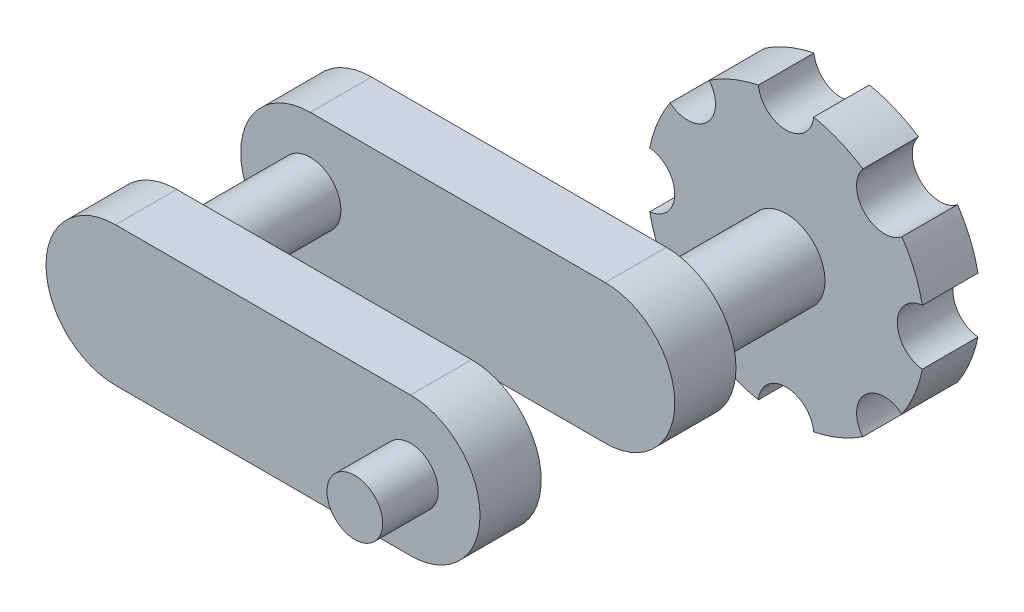
ISO-10303-21;
HEADER;
FILE_DESCRIPTION(('STEP AP214'),'2;1');
FILE_NAME('part.step','',(''),(''),'','','');
FILE_SCHEMA(('AUTOMOTIVE_DESIGN { 1 0 10303 214 1 1 1 1 }'));
ENDSEC;
DATA;
#1=APPLICATION_CONTEXT('core data for automotive mechanical design processes');
#2=APPLICATION_PROTOCOL_DEFINITION('international standard','automotive_design',2000,#1);
#3=PRODUCT_CONTEXT('',#1,'mechanical');
#4=PRODUCT('Part','Part','',(#3));
#5=PRODUCT_RELATED_PRODUCT_CATEGORY('part','',(#4));
#6=PRODUCT_DEFINITION_FORMATION('','',#4);
#7=PRODUCT_DEFINITION_CONTEXT('part definition',#1,'design');
#8=PRODUCT_DEFINITION('design','',#6,#7);
#9=PRODUCT_DEFINITION_SHAPE('','',#8);
#10=(LENGTH_UNIT() NAMED_UNIT(*) SI_UNIT(.MILLI.,.METRE.));
#11=(NAMED_UNIT(*) PLANE_ANGLE_UNIT() SI_UNIT($,.RADIAN.));
#12=(NAMED_UNIT(*) SI_UNIT($,.STERADIAN.) SOLID_ANGLE_UNIT());
#13=UNCERTAINTY_MEASURE_WITH_UNIT(LENGTH_MEASURE(1.E-05),#10,'distance_accuracy_value','');
#14=(GEOMETRIC_REPRESENTATION_CONTEXT(3) GLOBAL_UNCERTAINTY_ASSIGNED_CONTEXT((#13)) GLOBAL_UNIT_ASSIGNED_CONTEXT((#10,
#11,#12)) REPRESENTATION_CONTEXT('',''));
#15=CARTESIAN_POINT('',(0.,0.,0.));
#16=DIRECTION('',(0.,0.,1.));
#17=DIRECTION('',(1.,0.,0.));
#18=AXIS2_PLACEMENT_3D('',#15,#16,#17);
#19=CARTESIAN_POINT('',(0.,0.,-2.));
#20=DIRECTION('',(0.,0.,1.));
#21=DIRECTION('',(1.,0.,0.));
#22=AXIS2_PLACEMENT_3D('',#19,#20,#21);
#23=CYLINDRICAL_SURFACE('',#22,5.);
#24=DIRECTION('',(0.,0.,1.));
#25=VECTOR('',#24,1.);
#26=CARTESIAN_POINT('',(0.994987437106637,-4.9,-1.));
#27=LINE('',#26,#25);
#28=CARTESIAN_POINT('',(0.994987437106638,-4.9,0.));
#29=VERTEX_POINT('',#28);
#30=CARTESIAN_POINT('',(0.994987437106637,-4.9,-2.));
#31=VERTEX_POINT('',#30);
#32=EDGE_CURVE('E341',#29,#31,#27,.F.);
#33=ORIENTED_EDGE('',*,*,#32,.T.);
#34=CARTESIAN_POINT('',(0.,0.,-2.));
#35=DIRECTION('',(0.,0.,1.));
#36=DIRECTION('',(1.,0.,0.));
#37=AXIS2_PLACEMENT_3D('',#34,#35,#36);
#38=CIRCLE('',#37,5.);
#39=CARTESIAN_POINT('',(2.76126086384059,-4.16838559178758,-2.));
#40=VERTEX_POINT('',#39);
#41=EDGE_CURVE('E472',#31,#40,#38,.T.);
#42=ORIENTED_EDGE('',*,*,#41,.T.);
#43=DIRECTION('',(0.,0.,1.));
#44=VECTOR('',#43,1.);
#45=CARTESIAN_POINT('',(2.76126086384059,-4.16838559178758,-1.));
#46=LINE('',#45,#44);
#47=CARTESIAN_POINT('',(2.76126086384059,-4.16838559178758,0.));
#48=VERTEX_POINT('',#47);
#49=EDGE_CURVE('E368',#40,#48,#46,.T.);
#50=ORIENTED_EDGE('',*,*,#49,.T.);
#51=CARTESIAN_POINT('',(0.,0.,0.));
#52=DIRECTION('',(0.,0.,1.));
#53=DIRECTION('',(1.,0.,0.));
#54=AXIS2_PLACEMENT_3D('',#51,#52,#53);
#55=CIRCLE('',#54,5.);
#56=EDGE_CURVE('E457',#29,#48,#55,.T.);
#57=ORIENTED_EDGE('',*,*,#56,.F.);
#58=EDGE_LOOP('',(#33,#42,#50,#57));
#59=FACE_BOUND('',#58,.T.);
#60=ADVANCED_FACE('F36',(#59),#23,.T.);
#61=DIRECTION('',(0.,0.,1.));
#62=VECTOR('',#61,1.);
#63=CARTESIAN_POINT('',(4.16838559178761,-2.76126086384055,-1.));
#64=LINE('',#63,#62);
#65=CARTESIAN_POINT('',(4.16838559178761,-2.76126086384055,0.));
#66=VERTEX_POINT('',#65);
#67=CARTESIAN_POINT('',(4.16838559178761,-2.76126086384055,-2.));
#68=VERTEX_POINT('',#67);
#69=EDGE_CURVE('E362',#66,#68,#64,.F.);
#70=ORIENTED_EDGE('',*,*,#69,.T.);
#71=CARTESIAN_POINT('',(4.9,-0.99498743710662,-2.));
#72=VERTEX_POINT('',#71);
#73=EDGE_CURVE('E463',#68,#72,#38,.T.);
#74=ORIENTED_EDGE('',*,*,#73,.T.);
#75=DIRECTION('',(0.,0.,1.));
#76=VECTOR('',#75,1.);
#77=CARTESIAN_POINT('',(4.9,-0.99498743710662,-1.));
#78=LINE('',#77,#76);
#79=CARTESIAN_POINT('',(4.9,-0.994987437106621,0.));
#80=VERTEX_POINT('',#79);
#81=EDGE_CURVE('E357',#72,#80,#78,.T.);
#82=ORIENTED_EDGE('',*,*,#81,.T.);
#83=EDGE_CURVE('E224',#66,#80,#55,.T.);
#84=ORIENTED_EDGE('',*,*,#83,.F.);
#85=EDGE_LOOP('',(#70,#74,#82,#84));
#86=FACE_BOUND('',#85,.T.);
#87=ADVANCED_FACE('F429',(#86),#23,.T.);
#88=DIRECTION('',(0.,0.,1.));
#89=VECTOR('',#88,1.);
#90=CARTESIAN_POINT('',(4.9,0.99498743710662,-1.));
#91=LINE('',#90,#89);
#92=CARTESIAN_POINT('',(4.9,0.994987437106621,0.));
#93=VERTEX_POINT('',#92);
#94=CARTESIAN_POINT('',(4.9,0.99498743710662,-2.));
#95=VERTEX_POINT('',#94);
#96=EDGE_CURVE('E351',#93,#95,#91,.F.);
#97=ORIENTED_EDGE('',*,*,#96,.T.);
#98=CARTESIAN_POINT('',(4.16838559178757,2.7612608638406,-2.));
#99=VERTEX_POINT('',#98);
#100=EDGE_CURVE('E400',#95,#99,#38,.T.);
#101=ORIENTED_EDGE('',*,*,#100,.T.);
#102=DIRECTION('',(0.,0.,1.));
#103=VECTOR('',#102,1.);
#104=CARTESIAN_POINT('',(4.16838559178757,2.7612608638406,-1.));
#105=LINE('',#104,#103);
#106=CARTESIAN_POINT('',(4.16838559178757,2.7612608638406,0.));
#107=VERTEX_POINT('',#106);
#108=EDGE_CURVE('E347',#99,#107,#105,.T.);
#109=ORIENTED_EDGE('',*,*,#108,.T.);
#110=EDGE_CURVE('E221',#93,#107,#55,.T.);
#111=ORIENTED_EDGE('',*,*,#110,.F.);
#112=EDGE_LOOP('',(#97,#101,#109,#111));
#113=FACE_BOUND('',#112,.T.);
#114=ADVANCED_FACE('F435',(#113),#23,.T.);
#115=DIRECTION('',(0.,0.,1.));
#116=VECTOR('',#115,1.);
#117=CARTESIAN_POINT('',(2.76126086384053,4.16838559178762,-1.));
#118=LINE('',#117,#116);
#119=CARTESIAN_POINT('',(2.76126086384053,4.16838559178762,0.));
#120=VERTEX_POINT('',#119);
#121=CARTESIAN_POINT('',(2.76126086384053,4.16838559178762,-2.));
#122=VERTEX_POINT('',#121);
#123=EDGE_CURVE('E342',#120,#122,#118,.F.);
#124=ORIENTED_EDGE('',*,*,#123,.T.);
#125=CARTESIAN_POINT('',(0.994987437106568,4.90000000000001,-2.));
#126=VERTEX_POINT('',#125);
#127=EDGE_CURVE('E212',#122,#126,#38,.T.);
#128=ORIENTED_EDGE('',*,*,#127,.T.);
#129=DIRECTION('',(0.,0.,1.));
#130=VECTOR('',#129,1.);
#131=CARTESIAN_POINT('',(0.994987437106568,4.90000000000001,-1.));
#132=LINE('',#131,#130);
#133=CARTESIAN_POINT('',(0.99498743710657,4.90000000000001,0.));
#134=VERTEX_POINT('',#133);
#135=EDGE_CURVE('E198',#126,#134,#132,.T.);
#136=ORIENTED_EDGE('',*,*,#135,.T.);
#137=EDGE_CURVE('E210',#120,#134,#55,.T.);
#138=ORIENTED_EDGE('',*,*,#137,.F.);
#139=EDGE_LOOP('',(#124,#128,#136,#138));
#140=FACE_BOUND('',#139,.T.);
#141=ADVANCED_FACE('F209',(#140),#23,.T.);
#142=DIRECTION('',(0.,0.,1.));
#143=VECTOR('',#142,1.);
#144=CARTESIAN_POINT('',(-0.994987437106671,4.89999999999999,-1.));
#145=LINE('',#144,#143);
#146=CARTESIAN_POINT('',(-0.994987437106673,4.89999999999999,0.));
#147=VERTEX_POINT('',#146);
#148=CARTESIAN_POINT('',(-0.994987437106671,4.89999999999999,-2.));
#149=VERTEX_POINT('',#148);
#150=EDGE_CURVE('E60',#147,#149,#145,.F.);
#151=ORIENTED_EDGE('',*,*,#150,.T.);
#152=CARTESIAN_POINT('',(-2.76126086384062,4.16838559178756,-2.));
#153=VERTEX_POINT('',#152);
#154=EDGE_CURVE('E395',#149,#153,#38,.T.);
#155=ORIENTED_EDGE('',*,*,#154,.T.);
#156=DIRECTION('',(0.,0.,1.));
#157=VECTOR('',#156,1.);
#158=CARTESIAN_POINT('',(-2.76126086384062,4.16838559178756,-1.));
#159=LINE('',#158,#157);
#160=CARTESIAN_POINT('',(-2.76126086384062,4.16838559178756,0.));
#161=VERTEX_POINT('',#160);
#162=EDGE_CURVE('E384',#153,#161,#159,.T.);
#163=ORIENTED_EDGE('',*,*,#162,.T.);
#164=EDGE_CURVE('E222',#147,#161,#55,.T.);
#165=ORIENTED_EDGE('',*,*,#164,.F.);
#166=EDGE_LOOP('',(#151,#155,#163,#165));
#167=FACE_BOUND('',#166,.T.);
#168=ADVANCED_FACE('F394',(#167),#23,.T.);
#169=DIRECTION('',(0.,0.,1.));
#170=VECTOR('',#169,1.);
#171=CARTESIAN_POINT('',(-4.16838559178763,2.76126086384052,-1.));
#172=LINE('',#171,#170);
#173=CARTESIAN_POINT('',(-4.16838559178763,2.76126086384052,0.));
#174=VERTEX_POINT('',#173);
#175=CARTESIAN_POINT('',(-4.16838559178763,2.76126086384052,-2.));
#176=VERTEX_POINT('',#175);
#177=EDGE_CURVE('E52',#174,#176,#172,.F.);
#178=ORIENTED_EDGE('',*,*,#177,.T.);
#179=CARTESIAN_POINT('',(-4.9,0.99498743710662,-2.));
#180=VERTEX_POINT('',#179);
#181=EDGE_CURVE('E230',#176,#180,#38,.T.);
#182=ORIENTED_EDGE('',*,*,#181,.T.);
#183=DIRECTION('',(0.,0.,1.));
#184=VECTOR('',#183,1.);
#185=CARTESIAN_POINT('',(-4.9,0.99498743710662,-1.));
#186=LINE('',#185,#184);
#187=CARTESIAN_POINT('',(-4.9,0.994987437106621,0.));
#188=VERTEX_POINT('',#187);
#189=EDGE_CURVE('E317',#180,#188,#186,.T.);
#190=ORIENTED_EDGE('',*,*,#189,.T.);
#191=EDGE_CURVE('E225',#174,#188,#55,.T.);
#192=ORIENTED_EDGE('',*,*,#191,.F.);
#193=EDGE_LOOP('',(#178,#182,#190,#192));
#194=FACE_BOUND('',#193,.T.);
#195=ADVANCED_FACE('F403',(#194),#23,.T.);
#196=DIRECTION('',(0.,0.,1.));
#197=VECTOR('',#196,1.);
#198=CARTESIAN_POINT('',(-0.994987437106603,-4.9,-1.));
#199=LINE('',#198,#197);
#200=CARTESIAN_POINT('',(-0.994987437106603,-4.9,-2.));
#201=VERTEX_POINT('',#200);
#202=CARTESIAN_POINT('',(-0.994987437106604,-4.9,0.));
#203=VERTEX_POINT('',#202);
#204=EDGE_CURVE('E377',#201,#203,#199,.T.);
#205=ORIENTED_EDGE('',*,*,#204,.T.);
#206=CARTESIAN_POINT('',(-2.76126086384056,-4.1683855917876,0.));
#207=VERTEX_POINT('',#206);
#208=EDGE_CURVE('E231',#207,#203,#55,.T.);
#209=ORIENTED_EDGE('',*,*,#208,.F.);
#210=DIRECTION('',(0.,0.,1.));
#211=VECTOR('',#210,1.);
#212=CARTESIAN_POINT('',(-2.76126086384056,-4.1683855917876,-1.));
#213=LINE('',#212,#211);
#214=CARTESIAN_POINT('',(-2.76126086384056,-4.1683855917876,-2.));
#215=VERTEX_POINT('',#214);
#216=EDGE_CURVE('E328',#207,#215,#213,.F.);
#217=ORIENTED_EDGE('',*,*,#216,.T.);
#218=EDGE_CURVE('E242',#215,#201,#38,.T.);
#219=ORIENTED_EDGE('',*,*,#218,.T.);
#220=EDGE_LOOP('',(#205,#209,#217,#219));
#221=FACE_BOUND('',#220,.T.);
#222=ADVANCED_FACE('F439',(#221),#23,.T.);
#223=DIRECTION('',(0.,0.,1.));
#224=VECTOR('',#223,1.);
#225=CARTESIAN_POINT('',(-4.16838559178759,-2.76126086384058,-1.));
#226=LINE('',#225,#224);
#227=CARTESIAN_POINT('',(-4.16838559178759,-2.76126086384058,-2.));
#228=VERTEX_POINT('',#227);
#229=CARTESIAN_POINT('',(-4.16838559178759,-2.76126086384057,0.));
#230=VERTEX_POINT('',#229);
#231=EDGE_CURVE('E335',#228,#230,#226,.T.);
#232=ORIENTED_EDGE('',*,*,#231,.T.);
#233=CARTESIAN_POINT('',(-4.9,-0.994987437106621,0.));
#234=VERTEX_POINT('',#233);
#235=EDGE_CURVE('E226',#234,#230,#55,.T.);
#236=ORIENTED_EDGE('',*,*,#235,.F.);
#237=DIRECTION('',(0.,0.,1.));
#238=VECTOR('',#237,1.);
#239=CARTESIAN_POINT('',(-4.9,-0.99498743710662,-1.));
#240=LINE('',#239,#238);
#241=CARTESIAN_POINT('',(-4.9,-0.99498743710662,-2.));
#242=VERTEX_POINT('',#241);
#243=EDGE_CURVE('E322',#234,#242,#240,.F.);
#244=ORIENTED_EDGE('',*,*,#243,.T.);
#245=EDGE_CURVE('E232',#242,#228,#38,.T.);
#246=ORIENTED_EDGE('',*,*,#245,.T.);
#247=EDGE_LOOP('',(#232,#236,#244,#246));
#248=FACE_BOUND('',#247,.T.);
#249=ADVANCED_FACE('F413',(#248),#23,.T.);
#250=CARTESIAN_POINT('',(0.,0.,-2.));
#251=DIRECTION('',(0.,0.,1.));
#252=DIRECTION('',(1.,0.,0.));
#253=AXIS2_PLACEMENT_3D('',#250,#251,#252);
#254=PLANE('',#253);
#255=CARTESIAN_POINT('',(0.,0.,-2.));
#256=DIRECTION('',(0.,0.,1.));
#257=DIRECTION('',(1.,0.,0.));
#258=AXIS2_PLACEMENT_3D('',#255,#256,#257);
#259=CIRCLE('',#258,2.5);
#260=CARTESIAN_POINT('',(2.5,0.,-2.));
#261=VERTEX_POINT('',#260);
#262=EDGE_CURVE('E45',#261,#261,#259,.T.);
#263=ORIENTED_EDGE('',*,*,#262,.T.);
#264=EDGE_LOOP('',(#263));
#265=FACE_BOUND('',#264,.T.);
#266=ORIENTED_EDGE('',*,*,#41,.F.);
#267=CARTESIAN_POINT('',(0.,-5.,-2.));
#268=DIRECTION('',(0.,0.,-1.));
#269=DIRECTION('',(0.,-1.,0.));
#270=AXIS2_PLACEMENT_3D('',#267,#268,#269);
#271=CIRCLE('',#270,1.);
#272=EDGE_CURVE('E375',#201,#31,#271,.T.);
#273=ORIENTED_EDGE('',*,*,#272,.F.);
#274=ORIENTED_EDGE('',*,*,#218,.F.);
#275=CARTESIAN_POINT('',(-3.53553390593273,-3.53553390593274,-2.));
#276=DIRECTION('',(0.,0.,-1.));
#277=DIRECTION('',(-0.707106781186546,-0.707106781186549,0.));
#278=AXIS2_PLACEMENT_3D('',#275,#276,#277);
#279=CIRCLE('',#278,1.);
#280=EDGE_CURVE('E333',#228,#215,#279,.T.);
#281=ORIENTED_EDGE('',*,*,#280,.F.);
#282=ORIENTED_EDGE('',*,*,#245,.F.);
#283=CARTESIAN_POINT('',(-5.,0.,-2.));
#284=DIRECTION('',(0.,0.,-1.));
#285=DIRECTION('',(-1.,0.,0.));
#286=AXIS2_PLACEMENT_3D('',#283,#284,#285);
#287=CIRCLE('',#286,1.);
#288=EDGE_CURVE('E326',#180,#242,#287,.T.);
#289=ORIENTED_EDGE('',*,*,#288,.F.);
#290=ORIENTED_EDGE('',*,*,#181,.F.);
#291=CARTESIAN_POINT('',(-3.53553390593278,3.53553390593269,-2.));
#292=DIRECTION('',(0.,0.,-1.));
#293=DIRECTION('',(-0.707106781186556,0.707106781186539,0.));
#294=AXIS2_PLACEMENT_3D('',#291,#292,#293);
#295=CIRCLE('',#294,1.);
#296=EDGE_CURVE('E382',#153,#176,#295,.T.);
#297=ORIENTED_EDGE('',*,*,#296,.F.);
#298=ORIENTED_EDGE('',*,*,#154,.F.);
#299=CARTESIAN_POINT('',(0.,5.,-2.));
#300=DIRECTION('',(0.,0.,-1.));
#301=DIRECTION('',(0.,1.,0.));
#302=AXIS2_PLACEMENT_3D('',#299,#300,#301);
#303=CIRCLE('',#302,1.);
#304=EDGE_CURVE('E213',#126,#149,#303,.T.);
#305=ORIENTED_EDGE('',*,*,#304,.F.);
#306=ORIENTED_EDGE('',*,*,#127,.F.);
#307=CARTESIAN_POINT('',(3.53553390593271,3.53553390593277,-2.));
#308=DIRECTION('',(0.,0.,-1.));
#309=DIRECTION('',(0.707106781186541,0.707106781186554,0.));
#310=AXIS2_PLACEMENT_3D('',#307,#308,#309);
#311=CIRCLE('',#310,1.);
#312=EDGE_CURVE('E345',#99,#122,#311,.T.);
#313=ORIENTED_EDGE('',*,*,#312,.F.);
#314=ORIENTED_EDGE('',*,*,#100,.F.);
#315=CARTESIAN_POINT('',(5.,0.,-2.));
#316=DIRECTION('',(0.,0.,-1.));
#317=DIRECTION('',(1.,0.,0.));
#318=AXIS2_PLACEMENT_3D('',#315,#316,#317);
#319=CIRCLE('',#318,1.);
#320=EDGE_CURVE('E355',#72,#95,#319,.T.);
#321=ORIENTED_EDGE('',*,*,#320,.F.);
#322=ORIENTED_EDGE('',*,*,#73,.F.);
#323=CARTESIAN_POINT('',(3.53553390593276,-3.53553390593272,-2.));
#324=DIRECTION('',(0.,0.,-1.));
#325=DIRECTION('',(0.707106781186551,-0.707106781186544,0.));
#326=AXIS2_PLACEMENT_3D('',#323,#324,#325);
#327=CIRCLE('',#326,1.);
#328=EDGE_CURVE('E366',#40,#68,#327,.T.);
#329=ORIENTED_EDGE('',*,*,#328,.F.);
#330=EDGE_LOOP('',(#266,#273,#274,#281,#282,#289,#290,#297,#298,#305,#306,#313,#314,#321,#322,#329));
#331=FACE_BOUND('',#330,.T.);
#332=ADVANCED_FACE('F398',(#265,#331),#254,.F.);
#333=CARTESIAN_POINT('',(0.,0.,0.));
#334=DIRECTION('',(0.,0.,1.));
#335=DIRECTION('',(1.,0.,0.));
#336=AXIS2_PLACEMENT_3D('',#333,#334,#335);
#337=PLANE('',#336);
#338=CARTESIAN_POINT('',(0.,-5.,0.));
#339=DIRECTION('',(0.,0.,1.));
#340=DIRECTION('',(0.,1.,0.));
#341=AXIS2_PLACEMENT_3D('',#338,#339,#340);
#342=CIRCLE('',#341,1.);
#343=EDGE_CURVE('E365',#203,#29,#342,.F.);
#344=ORIENTED_EDGE('',*,*,#343,.T.);
#345=ORIENTED_EDGE('',*,*,#56,.T.);
#346=CARTESIAN_POINT('',(3.53553390593276,-3.53553390593272,0.));
#347=DIRECTION('',(0.,0.,1.));
#348=DIRECTION('',(-0.707106781186551,0.707106781186544,0.));
#349=AXIS2_PLACEMENT_3D('',#346,#347,#348);
#350=CIRCLE('',#349,1.);
#351=EDGE_CURVE('E354',#48,#66,#350,.F.);
#352=ORIENTED_EDGE('',*,*,#351,.T.);
#353=ORIENTED_EDGE('',*,*,#83,.T.);
#354=CARTESIAN_POINT('',(5.,0.,0.));
#355=DIRECTION('',(0.,0.,1.));
#356=DIRECTION('',(-1.,0.,0.));
#357=AXIS2_PLACEMENT_3D('',#354,#355,#356);
#358=CIRCLE('',#357,1.);
#359=EDGE_CURVE('E344',#80,#93,#358,.F.);
#360=ORIENTED_EDGE('',*,*,#359,.T.);
#361=ORIENTED_EDGE('',*,*,#110,.T.);
#362=CARTESIAN_POINT('',(3.53553390593271,3.53553390593277,0.));
#363=DIRECTION('',(0.,0.,1.));
#364=DIRECTION('',(-0.707106781186541,-0.707106781186554,0.));
#365=AXIS2_PLACEMENT_3D('',#362,#363,#364);
#366=CIRCLE('',#365,1.);
#367=EDGE_CURVE('E220',#107,#120,#366,.F.);
#368=ORIENTED_EDGE('',*,*,#367,.T.);
#369=ORIENTED_EDGE('',*,*,#137,.T.);
#370=CARTESIAN_POINT('',(0.,5.,0.));
#371=DIRECTION('',(0.,0.,1.));
#372=DIRECTION('',(0.,-1.,0.));
#373=AXIS2_PLACEMENT_3D('',#370,#371,#372);
#374=CIRCLE('',#373,1.);
#375=EDGE_CURVE('E195',#134,#147,#374,.F.);
#376=ORIENTED_EDGE('',*,*,#375,.T.);
#377=ORIENTED_EDGE('',*,*,#164,.T.);
#378=CARTESIAN_POINT('',(-3.53553390593278,3.53553390593269,0.));
#379=DIRECTION('',(0.,0.,1.));
#380=DIRECTION('',(0.707106781186556,-0.707106781186539,0.));
#381=AXIS2_PLACEMENT_3D('',#378,#379,#380);
#382=CIRCLE('',#381,1.);
#383=EDGE_CURVE('E387',#161,#174,#382,.F.);
#384=ORIENTED_EDGE('',*,*,#383,.T.);
#385=ORIENTED_EDGE('',*,*,#191,.T.);
#386=CARTESIAN_POINT('',(-5.,0.,0.));
#387=DIRECTION('',(0.,0.,1.));
#388=DIRECTION('',(1.,0.,0.));
#389=AXIS2_PLACEMENT_3D('',#386,#387,#388);
#390=CIRCLE('',#389,1.);
#391=EDGE_CURVE('E325',#188,#234,#390,.F.);
#392=ORIENTED_EDGE('',*,*,#391,.T.);
#393=ORIENTED_EDGE('',*,*,#235,.T.);
#394=CARTESIAN_POINT('',(-3.53553390593273,-3.53553390593274,0.));
#395=DIRECTION('',(0.,0.,1.));
#396=DIRECTION('',(0.707106781186546,0.707106781186549,0.));
#397=AXIS2_PLACEMENT_3D('',#394,#395,#396);
#398=CIRCLE('',#397,1.);
#399=EDGE_CURVE('E338',#230,#207,#398,.F.);
#400=ORIENTED_EDGE('',*,*,#399,.T.);
#401=ORIENTED_EDGE('',*,*,#208,.T.);
#402=EDGE_LOOP('',(#344,#345,#352,#353,#360,#361,#368,#369,#376,#377,#384,#385,#392,#393,#400,#401));
#403=FACE_BOUND('',#402,.T.);
#404=CARTESIAN_POINT('',(0.,0.,0.));
#405=DIRECTION('',(0.,0.,1.));
#406=DIRECTION('',(1.,0.,0.));
#407=AXIS2_PLACEMENT_3D('',#404,#405,#406);
#408=CIRCLE('',#407,1.4);
#409=CARTESIAN_POINT('',(-1.4,0.,0.));
#410=VERTEX_POINT('',#409);
#411=EDGE_CURVE('E235',#410,#410,#408,.T.);
#412=ORIENTED_EDGE('',*,*,#411,.F.);
#413=EDGE_LOOP('',(#412));
#414=FACE_BOUND('',#413,.T.);
#415=ADVANCED_FACE('F217',(#403,#414),#337,.T.);
#416=CARTESIAN_POINT('',(0.,0.,4.3));
#417=DIRECTION('',(0.,0.,-1.));
#418=DIRECTION('',(-1.,0.,0.));
#419=AXIS2_PLACEMENT_3D('',#416,#417,#418);
#420=CYLINDRICAL_SURFACE('',#419,1.4);
#421=CARTESIAN_POINT('',(0.,0.,4.3));
#422=DIRECTION('',(0.,0.,1.));
#423=DIRECTION('',(1.,0.,0.));
#424=AXIS2_PLACEMENT_3D('',#421,#422,#423);
#425=CIRCLE('',#424,1.4);
#426=CARTESIAN_POINT('',(-1.4,0.,4.3));
#427=VERTEX_POINT('',#426);
#428=EDGE_CURVE('E244',#427,#427,#425,.T.);
#429=CARTESIAN_POINT('',(-1.4,0.,4.3));
#430=CARTESIAN_POINT('',(-1.4,0.,4.25520833333333));
#431=CARTESIAN_POINT('',(-1.4,0.,4.21041666666667));
#432=CARTESIAN_POINT('',(-1.4,0.,4.12083333333333));
#433=CARTESIAN_POINT('',(-1.4,0.,4.07604166666667));
#434=CARTESIAN_POINT('',(-1.4,0.,3.98645833333333));
#435=CARTESIAN_POINT('',(-1.4,0.,3.94166666666667));
#436=CARTESIAN_POINT('',(-1.4,0.,3.85208333333333));
#437=CARTESIAN_POINT('',(-1.4,0.,3.80729166666667));
#438=CARTESIAN_POINT('',(-1.4,0.,3.71770833333333));
#439=CARTESIAN_POINT('',(-1.4,0.,3.67291666666667));
#440=CARTESIAN_POINT('',(-1.4,0.,3.58333333333333));
#441=CARTESIAN_POINT('',(-1.4,0.,3.53854166666667));
#442=CARTESIAN_POINT('',(-1.4,0.,3.44895833333333));
#443=CARTESIAN_POINT('',(-1.4,0.,3.40416666666667));
#444=CARTESIAN_POINT('',(-1.4,0.,3.31458333333333));
#445=CARTESIAN_POINT('',(-1.4,0.,3.26979166666667));
#446=CARTESIAN_POINT('',(-1.4,0.,3.18020833333333));
#447=CARTESIAN_POINT('',(-1.4,0.,3.13541666666667));
#448=CARTESIAN_POINT('',(-1.4,0.,3.04583333333333));
#449=CARTESIAN_POINT('',(-1.4,0.,3.00104166666667));
#450=CARTESIAN_POINT('',(-1.4,0.,2.91145833333333));
#451=CARTESIAN_POINT('',(-1.4,0.,2.86666666666667));
#452=CARTESIAN_POINT('',(-1.4,0.,2.77708333333333));
#453=CARTESIAN_POINT('',(-1.4,0.,2.73229166666667));
#454=CARTESIAN_POINT('',(-1.4,0.,2.64270833333333));
#455=CARTESIAN_POINT('',(-1.4,0.,2.59791666666667));
#456=CARTESIAN_POINT('',(-1.4,0.,2.50833333333333));
#457=CARTESIAN_POINT('',(-1.4,0.,2.46354166666667));
#458=CARTESIAN_POINT('',(-1.4,0.,2.37395833333333));
#459=CARTESIAN_POINT('',(-1.4,0.,2.32916666666667));
#460=CARTESIAN_POINT('',(-1.4,0.,2.23958333333333));
#461=CARTESIAN_POINT('',(-1.4,0.,2.19479166666667));
#462=CARTESIAN_POINT('',(-1.4,0.,2.10520833333333));
#463=CARTESIAN_POINT('',(-1.4,0.,2.06041666666667));
#464=CARTESIAN_POINT('',(-1.4,0.,1.97083333333333));
#465=CARTESIAN_POINT('',(-1.4,0.,1.92604166666667));
#466=CARTESIAN_POINT('',(-1.4,0.,1.83645833333333));
#467=CARTESIAN_POINT('',(-1.4,0.,1.79166666666667));
#468=CARTESIAN_POINT('',(-1.4,0.,1.70208333333333));
#469=CARTESIAN_POINT('',(-1.4,0.,1.65729166666667));
#470=CARTESIAN_POINT('',(-1.4,0.,1.56770833333333));
#471=CARTESIAN_POINT('',(-1.4,0.,1.52291666666667));
#472=CARTESIAN_POINT('',(-1.4,0.,1.43333333333333));
#473=CARTESIAN_POINT('',(-1.4,0.,1.38854166666667));
#474=CARTESIAN_POINT('',(-1.4,0.,1.29895833333333));
#475=CARTESIAN_POINT('',(-1.4,0.,1.25416666666667));
#476=CARTESIAN_POINT('',(-1.4,0.,1.16458333333333));
#477=CARTESIAN_POINT('',(-1.4,0.,1.11979166666667));
#478=CARTESIAN_POINT('',(-1.4,0.,1.03020833333333));
#479=CARTESIAN_POINT('',(-1.4,0.,0.985416666666665));
#480=CARTESIAN_POINT('',(-1.4,0.,0.895833333333332));
#481=CARTESIAN_POINT('',(-1.4,0.,0.851041666666665));
#482=CARTESIAN_POINT('',(-1.4,0.,0.761458333333332));
#483=CARTESIAN_POINT('',(-1.4,0.,0.716666666666665));
#484=CARTESIAN_POINT('',(-1.4,0.,0.627083333333332));
#485=CARTESIAN_POINT('',(-1.4,0.,0.582291666666665));
#486=CARTESIAN_POINT('',(-1.4,0.,0.492708333333332));
#487=CARTESIAN_POINT('',(-1.4,0.,0.447916666666665));
#488=CARTESIAN_POINT('',(-1.4,0.,0.358333333333332));
#489=CARTESIAN_POINT('',(-1.4,0.,0.313541666666666));
#490=CARTESIAN_POINT('',(-1.4,0.,0.223958333333332));
#491=CARTESIAN_POINT('',(-1.4,0.,0.179166666666666));
#492=CARTESIAN_POINT('',(-1.4,0.,0.0895833333333324));
#493=CARTESIAN_POINT('',(-1.4,0.,0.0447916666666658));
#494=CARTESIAN_POINT('',(-1.4,0.,0.));
#495=B_SPLINE_CURVE_WITH_KNOTS('',3,(#429,#430,#431,#432,#433,#434,#435,#436,#437,#438,#439,
#440,#441,#442,#443,#444,#445,#446,#447,#448,#449,#450,#451,#452,#453,#454,#455,#456,#457,#458,
#459,#460,#461,#462,#463,#464,#465,#466,#467,#468,#469,#470,#471,#472,#473,#474,#475,#476,#477,
#478,#479,#480,#481,#482,#483,#484,#485,#486,#487,#488,#489,#490,#491,#492,#493,#494),
.UNSPECIFIED.,.F.,.F.,(4,2,2,2,2,2,2,2,2,2,2,2,2,2,2,2,2,2,2,2,2,2,2,2,2,2,2,2,2,2,2,2,4),(0.,
0.134375000000001,0.268750000000001,0.403125000000001,0.537500000000001,0.671875000000001,
0.806250000000001,0.940625,1.075,1.209375,1.34375,1.478125,1.6125,1.746875,1.88125,2.015625,
2.15,2.284375,2.41875,2.553125,2.6875,2.821875,2.95625,3.090625,3.225,3.359375,3.49375,3.628125,
3.7625,3.896875,4.03125,4.165625,4.3),.UNSPECIFIED.);
#496=EDGE_CURVE('BSEAM550',#427,#410,#495,.T.);
#497=ORIENTED_EDGE('',*,*,#428,.F.);
#498=ORIENTED_EDGE('',*,*,#411,.T.);
#499=ORIENTED_EDGE('',*,*,#496,.T.);
#500=ORIENTED_EDGE('',*,*,#496,.F.);
#501=EDGE_LOOP('',(#497,#499,#498,#500));
#502=FACE_BOUND('',#501,.T.);
#503=ADVANCED_FACE('F550',(#502),#420,.T.);
#504=CARTESIAN_POINT('',(0.,0.,6.5));
#505=DIRECTION('',(0.,0.,-1.));
#506=DIRECTION('',(-1.,0.,0.));
#507=AXIS2_PLACEMENT_3D('',#504,#505,#506);
#508=CYLINDRICAL_SURFACE('',#507,2.5);
#509=CARTESIAN_POINT('',(0.,0.,4.3));
#510=DIRECTION('',(0.,0.,1.));
#511=DIRECTION('',(1.,0.,0.));
#512=AXIS2_PLACEMENT_3D('',#509,#510,#511);
#513=CIRCLE('',#512,2.5);
#514=CARTESIAN_POINT('',(0.,-2.5,4.3));
#515=VERTEX_POINT('',#514);
#516=CARTESIAN_POINT('',(0.,2.5,4.3));
#517=VERTEX_POINT('',#516);
#518=EDGE_CURVE('E267',#515,#517,#513,.T.);
#519=ORIENTED_EDGE('',*,*,#518,.T.);
#520=DIRECTION('',(0.,0.,-1.));
#521=VECTOR('',#520,1.);
#522=CARTESIAN_POINT('',(0.,2.5,6.5));
#523=LINE('',#522,#521);
#524=CARTESIAN_POINT('',(0.,2.5,6.5));
#525=VERTEX_POINT('',#524);
#526=EDGE_CURVE('E247',#525,#517,#523,.T.);
#527=ORIENTED_EDGE('',*,*,#526,.F.);
#528=CARTESIAN_POINT('',(0.,0.,6.5));
#529=DIRECTION('',(0.,0.,1.));
#530=DIRECTION('',(1.,0.,0.));
#531=AXIS2_PLACEMENT_3D('',#528,#529,#530);
#532=CIRCLE('',#531,2.5);
#533=CARTESIAN_POINT('',(0.,-2.5,6.5));
#534=VERTEX_POINT('',#533);
#535=EDGE_CURVE('E262',#534,#525,#532,.T.);
#536=ORIENTED_EDGE('',*,*,#535,.F.);
#537=DIRECTION('',(0.,0.,-1.));
#538=VECTOR('',#537,1.);
#539=CARTESIAN_POINT('',(0.,-2.5,6.5));
#540=LINE('',#539,#538);
#541=EDGE_CURVE('E256',#534,#515,#540,.T.);
#542=ORIENTED_EDGE('',*,*,#541,.T.);
#543=EDGE_LOOP('',(#519,#527,#536,#542));
#544=FACE_BOUND('',#543,.T.);
#545=ADVANCED_FACE('F546',(#544),#508,.T.);
#546=CARTESIAN_POINT('',(0.,2.5,6.5));
#547=DIRECTION('',(0.,-1.,0.));
#548=DIRECTION('',(1.,0.,0.));
#549=AXIS2_PLACEMENT_3D('',#546,#547,#548);
#550=PLANE('',#549);
#551=DIRECTION('',(-1.,0.,0.));
#552=VECTOR('',#551,1.);
#553=CARTESIAN_POINT('',(0.,2.5,4.3));
#554=LINE('',#553,#552);
#555=CARTESIAN_POINT('',(-10.6,2.5,4.3));
#556=VERTEX_POINT('',#555);
#557=EDGE_CURVE('E265',#517,#556,#554,.T.);
#558=ORIENTED_EDGE('',*,*,#557,.T.);
#559=DIRECTION('',(0.,0.,-1.));
#560=VECTOR('',#559,1.);
#561=CARTESIAN_POINT('',(-10.6,2.5,6.5));
#562=LINE('',#561,#560);
#563=CARTESIAN_POINT('',(-10.6,2.5,6.5));
#564=VERTEX_POINT('',#563);
#565=EDGE_CURVE('E250',#564,#556,#562,.T.);
#566=ORIENTED_EDGE('',*,*,#565,.F.);
#567=DIRECTION('',(-1.,0.,0.));
#568=VECTOR('',#567,1.);
#569=CARTESIAN_POINT('',(0.,2.5,6.5));
#570=LINE('',#569,#568);
#571=EDGE_CURVE('E274',#525,#564,#570,.T.);
#572=ORIENTED_EDGE('',*,*,#571,.F.);
#573=ORIENTED_EDGE('',*,*,#526,.T.);
#574=EDGE_LOOP('',(#558,#566,#572,#573));
#575=FACE_BOUND('',#574,.T.);
#576=ADVANCED_FACE('F542',(#575),#550,.F.);
#577=CARTESIAN_POINT('',(-10.6,0.,6.5));
#578=DIRECTION('',(0.,0.,-1.));
#579=DIRECTION('',(-1.,0.,0.));
#580=AXIS2_PLACEMENT_3D('',#577,#578,#579);
#581=CYLINDRICAL_SURFACE('',#580,2.5);
#582=CARTESIAN_POINT('',(-10.6,0.,4.3));
#583=DIRECTION('',(0.,0.,1.));
#584=DIRECTION('',(1.,0.,0.));
#585=AXIS2_PLACEMENT_3D('',#582,#583,#584);
#586=CIRCLE('',#585,2.5);
#587=CARTESIAN_POINT('',(-10.6,-2.5,4.3));
#588=VERTEX_POINT('',#587);
#589=EDGE_CURVE('E263',#556,#588,#586,.T.);
#590=ORIENTED_EDGE('',*,*,#589,.T.);
#591=DIRECTION('',(0.,0.,-1.));
#592=VECTOR('',#591,1.);
#593=CARTESIAN_POINT('',(-10.6,-2.5,6.5));
#594=LINE('',#593,#592);
#595=CARTESIAN_POINT('',(-10.6,-2.5,6.5));
#596=VERTEX_POINT('',#595);
#597=EDGE_CURVE('E253',#596,#588,#594,.T.);
#598=ORIENTED_EDGE('',*,*,#597,.F.);
#599=CARTESIAN_POINT('',(-10.6,0.,6.5));
#600=DIRECTION('',(0.,0.,1.));
#601=DIRECTION('',(1.,0.,0.));
#602=AXIS2_PLACEMENT_3D('',#599,#600,#601);
#603=CIRCLE('',#602,2.5);
#604=EDGE_CURVE('E272',#564,#596,#603,.T.);
#605=ORIENTED_EDGE('',*,*,#604,.F.);
#606=ORIENTED_EDGE('',*,*,#565,.T.);
#607=EDGE_LOOP('',(#590,#598,#605,#606));
#608=FACE_BOUND('',#607,.T.);
#609=ADVANCED_FACE('F538',(#608),#581,.T.);
#610=CARTESIAN_POINT('',(0.,-2.5,6.5));
#611=DIRECTION('',(0.,1.,0.));
#612=DIRECTION('',(-1.,0.,0.));
#613=AXIS2_PLACEMENT_3D('',#610,#611,#612);
#614=PLANE('',#613);
#615=DIRECTION('',(1.,0.,0.));
#616=VECTOR('',#615,1.);
#617=CARTESIAN_POINT('',(0.,-2.5,4.3));
#618=LINE('',#617,#616);
#619=EDGE_CURVE('E260',#588,#515,#618,.T.);
#620=ORIENTED_EDGE('',*,*,#619,.T.);
#621=ORIENTED_EDGE('',*,*,#541,.F.);
#622=DIRECTION('',(1.,0.,0.));
#623=VECTOR('',#622,1.);
#624=CARTESIAN_POINT('',(0.,-2.5,6.5));
#625=LINE('',#624,#623);
#626=EDGE_CURVE('E259',#596,#534,#625,.T.);
#627=ORIENTED_EDGE('',*,*,#626,.F.);
#628=ORIENTED_EDGE('',*,*,#597,.T.);
#629=EDGE_LOOP('',(#620,#621,#627,#628));
#630=FACE_BOUND('',#629,.T.);
#631=ADVANCED_FACE('F531',(#630),#614,.F.);
#632=CARTESIAN_POINT('',(0.,0.,6.5));
#633=DIRECTION('',(0.,0.,1.));
#634=DIRECTION('',(1.,0.,0.));
#635=AXIS2_PLACEMENT_3D('',#632,#633,#634);
#636=PLANE('',#635);
#637=CARTESIAN_POINT('',(-10.6,0.,6.5));
#638=DIRECTION('',(0.,0.,1.));
#639=DIRECTION('',(1.,0.,0.));
#640=AXIS2_PLACEMENT_3D('',#637,#638,#639);
#641=CIRCLE('',#640,1.1);
#642=CARTESIAN_POINT('',(-9.5,0.,6.5));
#643=VERTEX_POINT('',#642);
#644=EDGE_CURVE('E278',#643,#643,#641,.T.);
#645=ORIENTED_EDGE('',*,*,#644,.F.);
#646=EDGE_LOOP('',(#645));
#647=FACE_BOUND('',#646,.T.);
#648=ORIENTED_EDGE('',*,*,#535,.T.);
#649=ORIENTED_EDGE('',*,*,#571,.T.);
#650=ORIENTED_EDGE('',*,*,#604,.T.);
#651=ORIENTED_EDGE('',*,*,#626,.T.);
#652=EDGE_LOOP('',(#648,#649,#650,#651));
#653=FACE_BOUND('',#652,.T.);
#654=ADVANCED_FACE('F528',(#647,#653),#636,.T.);
#655=CARTESIAN_POINT('',(0.,0.,4.3));
#656=DIRECTION('',(0.,0.,1.));
#657=DIRECTION('',(1.,0.,0.));
#658=AXIS2_PLACEMENT_3D('',#655,#656,#657);
#659=PLANE('',#658);
#660=ORIENTED_EDGE('',*,*,#428,.T.);
#661=EDGE_LOOP('',(#660));
#662=FACE_BOUND('',#661,.T.);
#663=ORIENTED_EDGE('',*,*,#518,.F.);
#664=ORIENTED_EDGE('',*,*,#619,.F.);
#665=ORIENTED_EDGE('',*,*,#589,.F.);
#666=ORIENTED_EDGE('',*,*,#557,.F.);
#667=EDGE_LOOP('',(#663,#664,#665,#666));
#668=FACE_BOUND('',#667,.T.);
#669=ADVANCED_FACE('F526',(#662,#668),#659,.F.);
#670=CARTESIAN_POINT('',(-10.6,0.,11.3));
#671=DIRECTION('',(0.,0.,-1.));
#672=DIRECTION('',(-1.,0.,0.));
#673=AXIS2_PLACEMENT_3D('',#670,#671,#672);
#674=CYLINDRICAL_SURFACE('',#673,1.1);
#675=CARTESIAN_POINT('',(-10.6,0.,11.3));
#676=DIRECTION('',(0.,0.,1.));
#677=DIRECTION('',(1.,0.,0.));
#678=AXIS2_PLACEMENT_3D('',#675,#676,#677);
#679=CIRCLE('',#678,1.1);
#680=CARTESIAN_POINT('',(-9.5,0.,11.3));
#681=VERTEX_POINT('',#680);
#682=EDGE_CURVE('E270',#681,#681,#679,.T.);
#683=ORIENTED_EDGE('',*,*,#682,.F.);
#684=EDGE_LOOP('',(#683));
#685=FACE_BOUND('',#684,.T.);
#686=ORIENTED_EDGE('',*,*,#644,.T.);
#687=EDGE_LOOP('',(#686));
#688=FACE_BOUND('',#687,.T.);
#689=ADVANCED_FACE('F522',(#685,#688),#674,.T.);
#690=CARTESIAN_POINT('',(-10.6,0.,13.5));
#691=DIRECTION('',(0.,0.,-1.));
#692=DIRECTION('',(-1.,0.,0.));
#693=AXIS2_PLACEMENT_3D('',#690,#691,#692);
#694=CYLINDRICAL_SURFACE('',#693,2.5);
#695=CARTESIAN_POINT('',(-10.6,0.,11.3));
#696=DIRECTION('',(0.,0.,1.));
#697=DIRECTION('',(1.,0.,0.));
#698=AXIS2_PLACEMENT_3D('',#695,#696,#697);
#699=CIRCLE('',#698,2.5);
#700=CARTESIAN_POINT('',(-10.6,2.5,11.3));
#701=VERTEX_POINT('',#700);
#702=CARTESIAN_POINT('',(-10.6,-2.5,11.3));
#703=VERTEX_POINT('',#702);
#704=EDGE_CURVE('E303',#701,#703,#699,.T.);
#705=ORIENTED_EDGE('',*,*,#704,.T.);
#706=DIRECTION('',(0.,0.,-1.));
#707=VECTOR('',#706,1.);
#708=CARTESIAN_POINT('',(-10.6,-2.5,13.5));
#709=LINE('',#708,#707);
#710=CARTESIAN_POINT('',(-10.6,-2.5,13.5));
#711=VERTEX_POINT('',#710);
#712=EDGE_CURVE('E281',#711,#703,#709,.T.);
#713=ORIENTED_EDGE('',*,*,#712,.F.);
#714=CARTESIAN_POINT('',(-10.6,0.,13.5));
#715=DIRECTION('',(0.,0.,1.));
#716=DIRECTION('',(1.,0.,0.));
#717=AXIS2_PLACEMENT_3D('',#714,#715,#716);
#718=CIRCLE('',#717,2.5);
#719=CARTESIAN_POINT('',(-10.6,2.5,13.5));
#720=VERTEX_POINT('',#719);
#721=EDGE_CURVE('E298',#720,#711,#718,.T.);
#722=ORIENTED_EDGE('',*,*,#721,.F.);
#723=DIRECTION('',(0.,0.,-1.));
#724=VECTOR('',#723,1.);
#725=CARTESIAN_POINT('',(-10.6,2.5,13.5));
#726=LINE('',#725,#724);
#727=EDGE_CURVE('E292',#720,#701,#726,.T.);
#728=ORIENTED_EDGE('',*,*,#727,.T.);
#729=EDGE_LOOP('',(#705,#713,#722,#728));
#730=FACE_BOUND('',#729,.T.);
#731=ADVANCED_FACE('F518',(#730),#694,.T.);
#732=CARTESIAN_POINT('',(-10.6,-2.5,13.5));
#733=DIRECTION('',(0.,1.,0.));
#734=DIRECTION('',(0.,0.,1.));
#735=AXIS2_PLACEMENT_3D('',#732,#733,#734);
#736=PLANE('',#735);
#737=DIRECTION('',(1.,0.,0.));
#738=VECTOR('',#737,1.);
#739=CARTESIAN_POINT('',(-10.6,-2.5,11.3));
#740=LINE('',#739,#738);
#741=CARTESIAN_POINT('',(0.,-2.5,11.3));
#742=VERTEX_POINT('',#741);
#743=EDGE_CURVE('E301',#703,#742,#740,.T.);
#744=ORIENTED_EDGE('',*,*,#743,.T.);
#745=DIRECTION('',(0.,0.,-1.));
#746=VECTOR('',#745,1.);
#747=CARTESIAN_POINT('',(0.,-2.5,13.5));
#748=LINE('',#747,#746);
#749=CARTESIAN_POINT('',(0.,-2.5,13.5));
#750=VERTEX_POINT('',#749);
#751=EDGE_CURVE('E286',#750,#742,#748,.T.);
#752=ORIENTED_EDGE('',*,*,#751,.F.);
#753=DIRECTION('',(1.,0.,0.));
#754=VECTOR('',#753,1.);
#755=CARTESIAN_POINT('',(-10.6,-2.5,13.5));
#756=LINE('',#755,#754);
#757=EDGE_CURVE('E310',#711,#750,#756,.T.);
#758=ORIENTED_EDGE('',*,*,#757,.F.);
#759=ORIENTED_EDGE('',*,*,#712,.T.);
#760=EDGE_LOOP('',(#744,#752,#758,#759));
#761=FACE_BOUND('',#760,.T.);
#762=ADVANCED_FACE('F514',(#761),#736,.F.);
#763=CARTESIAN_POINT('',(0.,0.,13.5));
#764=DIRECTION('',(0.,0.,-1.));
#765=DIRECTION('',(-1.,0.,0.));
#766=AXIS2_PLACEMENT_3D('',#763,#764,#765);
#767=CYLINDRICAL_SURFACE('',#766,2.5);
#768=CARTESIAN_POINT('',(0.,0.,11.3));
#769=DIRECTION('',(0.,0.,1.));
#770=DIRECTION('',(1.,0.,0.));
#771=AXIS2_PLACEMENT_3D('',#768,#769,#770);
#772=CIRCLE('',#771,2.5);
#773=CARTESIAN_POINT('',(0.,2.5,11.3));
#774=VERTEX_POINT('',#773);
#775=EDGE_CURVE('E299',#742,#774,#772,.T.);
#776=ORIENTED_EDGE('',*,*,#775,.T.);
#777=DIRECTION('',(0.,0.,-1.));
#778=VECTOR('',#777,1.);
#779=CARTESIAN_POINT('',(0.,2.5,13.5));
#780=LINE('',#779,#778);
#781=CARTESIAN_POINT('',(0.,2.5,13.5));
#782=VERTEX_POINT('',#781);
#783=EDGE_CURVE('E289',#782,#774,#780,.T.);
#784=ORIENTED_EDGE('',*,*,#783,.F.);
#785=CARTESIAN_POINT('',(0.,0.,13.5));
#786=DIRECTION('',(0.,0.,1.));
#787=DIRECTION('',(1.,0.,0.));
#788=AXIS2_PLACEMENT_3D('',#785,#786,#787);
#789=CIRCLE('',#788,2.5);
#790=EDGE_CURVE('E308',#750,#782,#789,.T.);
#791=ORIENTED_EDGE('',*,*,#790,.F.);
#792=ORIENTED_EDGE('',*,*,#751,.T.);
#793=EDGE_LOOP('',(#776,#784,#791,#792));
#794=FACE_BOUND('',#793,.T.);
#795=ADVANCED_FACE('F510',(#794),#767,.T.);
#796=CARTESIAN_POINT('',(-10.6,2.5,13.5));
#797=DIRECTION('',(0.,-1.,0.));
#798=DIRECTION('',(0.,0.,-1.));
#799=AXIS2_PLACEMENT_3D('',#796,#797,#798);
#800=PLANE('',#799);
#801=DIRECTION('',(-1.,0.,0.));
#802=VECTOR('',#801,1.);
#803=CARTESIAN_POINT('',(-10.6,2.5,11.3));
#804=LINE('',#803,#802);
#805=EDGE_CURVE('E296',#774,#701,#804,.T.);
#806=ORIENTED_EDGE('',*,*,#805,.T.);
#807=ORIENTED_EDGE('',*,*,#727,.F.);
#808=DIRECTION('',(-1.,0.,0.));
#809=VECTOR('',#808,1.);
#810=CARTESIAN_POINT('',(-10.6,2.5,13.5));
#811=LINE('',#810,#809);
#812=EDGE_CURVE('E295',#782,#720,#811,.T.);
#813=ORIENTED_EDGE('',*,*,#812,.F.);
#814=ORIENTED_EDGE('',*,*,#783,.T.);
#815=EDGE_LOOP('',(#806,#807,#813,#814));
#816=FACE_BOUND('',#815,.T.);
#817=ADVANCED_FACE('F503',(#816),#800,.F.);
#818=CARTESIAN_POINT('',(-10.6,0.,13.5));
#819=DIRECTION('',(0.,0.,1.));
#820=DIRECTION('',(1.,0.,0.));
#821=AXIS2_PLACEMENT_3D('',#818,#819,#820);
#822=PLANE('',#821);
#823=CARTESIAN_POINT('',(0.,0.,13.5));
#824=DIRECTION('',(0.,0.,1.));
#825=DIRECTION('',(1.,0.,0.));
#826=AXIS2_PLACEMENT_3D('',#823,#824,#825);
#827=CIRCLE('',#826,1.);
#828=CARTESIAN_POINT('',(1.,0.,13.5));
#829=VERTEX_POINT('',#828);
#830=EDGE_CURVE('E314',#829,#829,#827,.T.);
#831=ORIENTED_EDGE('',*,*,#830,.F.);
#832=EDGE_LOOP('',(#831));
#833=FACE_BOUND('',#832,.T.);
#834=ORIENTED_EDGE('',*,*,#721,.T.);
#835=ORIENTED_EDGE('',*,*,#757,.T.);
#836=ORIENTED_EDGE('',*,*,#790,.T.);
#837=ORIENTED_EDGE('',*,*,#812,.T.);
#838=EDGE_LOOP('',(#834,#835,#836,#837));
#839=FACE_BOUND('',#838,.T.);
#840=ADVANCED_FACE('F500',(#833,#839),#822,.T.);
#841=CARTESIAN_POINT('',(-10.6,0.,11.3));
#842=DIRECTION('',(0.,0.,1.));
#843=DIRECTION('',(1.,0.,0.));
#844=AXIS2_PLACEMENT_3D('',#841,#842,#843);
#845=PLANE('',#844);
#846=ORIENTED_EDGE('',*,*,#682,.T.);
#847=EDGE_LOOP('',(#846));
#848=FACE_BOUND('',#847,.T.);
#849=ORIENTED_EDGE('',*,*,#704,.F.);
#850=ORIENTED_EDGE('',*,*,#805,.F.);
#851=ORIENTED_EDGE('',*,*,#775,.F.);
#852=ORIENTED_EDGE('',*,*,#743,.F.);
#853=EDGE_LOOP('',(#849,#850,#851,#852));
#854=FACE_BOUND('',#853,.T.);
#855=ADVANCED_FACE('F498',(#848,#854),#845,.F.);
#856=CARTESIAN_POINT('',(0.,0.,15.5));
#857=DIRECTION('',(0.,0.,-1.));
#858=DIRECTION('',(-1.,0.,0.));
#859=AXIS2_PLACEMENT_3D('',#856,#857,#858);
#860=CYLINDRICAL_SURFACE('',#859,1.);
#861=CARTESIAN_POINT('',(0.,0.,15.5));
#862=DIRECTION('',(0.,0.,1.));
#863=DIRECTION('',(1.,0.,0.));
#864=AXIS2_PLACEMENT_3D('',#861,#862,#863);
#865=CIRCLE('',#864,1.);
#866=CARTESIAN_POINT('',(1.,0.,15.5));
#867=VERTEX_POINT('',#866);
#868=EDGE_CURVE('E306',#867,#867,#865,.T.);
#869=ORIENTED_EDGE('',*,*,#868,.F.);
#870=EDGE_LOOP('',(#869));
#871=FACE_BOUND('',#870,.T.);
#872=ORIENTED_EDGE('',*,*,#830,.T.);
#873=EDGE_LOOP('',(#872));
#874=FACE_BOUND('',#873,.T.);
#875=ADVANCED_FACE('F494',(#871,#874),#860,.T.);
#876=CARTESIAN_POINT('',(0.,0.,15.5));
#877=DIRECTION('',(0.,0.,1.));
#878=DIRECTION('',(1.,0.,0.));
#879=AXIS2_PLACEMENT_3D('',#876,#877,#878);
#880=PLANE('',#879);
#881=ORIENTED_EDGE('',*,*,#868,.T.);
#882=EDGE_LOOP('',(#881));
#883=FACE_BOUND('',#882,.T.);
#884=ADVANCED_FACE('F491',(#883),#880,.T.);
#885=CARTESIAN_POINT('',(-5.,0.,15.501));
#886=DIRECTION('',(0.,0.,-1.));
#887=DIRECTION('',(-1.,0.,0.));
#888=AXIS2_PLACEMENT_3D('',#885,#886,#887);
#889=CYLINDRICAL_SURFACE('',#888,1.);
#890=ORIENTED_EDGE('',*,*,#391,.F.);
#891=ORIENTED_EDGE('',*,*,#189,.F.);
#892=ORIENTED_EDGE('',*,*,#288,.T.);
#893=ORIENTED_EDGE('',*,*,#243,.F.);
#894=EDGE_LOOP('',(#890,#891,#892,#893));
#895=FACE_BOUND('',#894,.T.);
#896=ADVANCED_FACE('F408',(#895),#889,.F.);
#897=CARTESIAN_POINT('',(-3.53553390593273,-3.53553390593274,15.501));
#898=DIRECTION('',(0.,0.,-1.));
#899=DIRECTION('',(-0.707106781186546,-0.707106781186549,0.));
#900=AXIS2_PLACEMENT_3D('',#897,#898,#899);
#901=CYLINDRICAL_SURFACE('',#900,1.);
#902=ORIENTED_EDGE('',*,*,#399,.F.);
#903=ORIENTED_EDGE('',*,*,#231,.F.);
#904=ORIENTED_EDGE('',*,*,#280,.T.);
#905=ORIENTED_EDGE('',*,*,#216,.F.);
#906=EDGE_LOOP('',(#902,#903,#904,#905));
#907=FACE_BOUND('',#906,.T.);
#908=ADVANCED_FACE('F417',(#907),#901,.F.);
#909=CARTESIAN_POINT('',(-3.53553390593278,3.53553390593269,15.501));
#910=DIRECTION('',(0.,0.,-1.));
#911=DIRECTION('',(-0.707106781186556,0.707106781186539,0.));
#912=AXIS2_PLACEMENT_3D('',#909,#910,#911);
#913=CYLINDRICAL_SURFACE('',#912,1.);
#914=ORIENTED_EDGE('',*,*,#383,.F.);
#915=ORIENTED_EDGE('',*,*,#162,.F.);
#916=ORIENTED_EDGE('',*,*,#296,.T.);
#917=ORIENTED_EDGE('',*,*,#177,.F.);
#918=EDGE_LOOP('',(#914,#915,#916,#917));
#919=FACE_BOUND('',#918,.T.);
#920=ADVANCED_FACE('F415',(#919),#913,.F.);
#921=CARTESIAN_POINT('',(0.,5.,15.501));
#922=DIRECTION('',(0.,0.,-1.));
#923=DIRECTION('',(0.,1.,0.));
#924=AXIS2_PLACEMENT_3D('',#921,#922,#923);
#925=CYLINDRICAL_SURFACE('',#924,1.);
#926=ORIENTED_EDGE('',*,*,#375,.F.);
#927=ORIENTED_EDGE('',*,*,#135,.F.);
#928=ORIENTED_EDGE('',*,*,#304,.T.);
#929=ORIENTED_EDGE('',*,*,#150,.F.);
#930=EDGE_LOOP('',(#926,#927,#928,#929));
#931=FACE_BOUND('',#930,.T.);
#932=ADVANCED_FACE('F197',(#931),#925,.F.);
#933=CARTESIAN_POINT('',(3.53553390593271,3.53553390593277,15.501));
#934=DIRECTION('',(0.,0.,-1.));
#935=DIRECTION('',(0.707106781186541,0.707106781186554,0.));
#936=AXIS2_PLACEMENT_3D('',#933,#934,#935);
#937=CYLINDRICAL_SURFACE('',#936,1.);
#938=ORIENTED_EDGE('',*,*,#367,.F.);
#939=ORIENTED_EDGE('',*,*,#108,.F.);
#940=ORIENTED_EDGE('',*,*,#312,.T.);
#941=ORIENTED_EDGE('',*,*,#123,.F.);
#942=EDGE_LOOP('',(#938,#939,#940,#941));
#943=FACE_BOUND('',#942,.T.);
#944=ADVANCED_FACE('F423',(#943),#937,.F.);
#945=CARTESIAN_POINT('',(5.,0.,15.501));
#946=DIRECTION('',(0.,0.,-1.));
#947=DIRECTION('',(1.,0.,0.));
#948=AXIS2_PLACEMENT_3D('',#945,#946,#947);
#949=CYLINDRICAL_SURFACE('',#948,1.);
#950=ORIENTED_EDGE('',*,*,#359,.F.);
#951=ORIENTED_EDGE('',*,*,#81,.F.);
#952=ORIENTED_EDGE('',*,*,#320,.T.);
#953=ORIENTED_EDGE('',*,*,#96,.F.);
#954=EDGE_LOOP('',(#950,#951,#952,#953));
#955=FACE_BOUND('',#954,.T.);
#956=ADVANCED_FACE('F466',(#955),#949,.F.);
#957=CARTESIAN_POINT('',(3.53553390593276,-3.53553390593272,15.501));
#958=DIRECTION('',(0.,0.,-1.));
#959=DIRECTION('',(0.707106781186551,-0.707106781186544,0.));
#960=AXIS2_PLACEMENT_3D('',#957,#958,#959);
#961=CYLINDRICAL_SURFACE('',#960,1.);
#962=ORIENTED_EDGE('',*,*,#351,.F.);
#963=ORIENTED_EDGE('',*,*,#49,.F.);
#964=ORIENTED_EDGE('',*,*,#328,.T.);
#965=ORIENTED_EDGE('',*,*,#69,.F.);
#966=EDGE_LOOP('',(#962,#963,#964,#965));
#967=FACE_BOUND('',#966,.T.);
#968=ADVANCED_FACE('F475',(#967),#961,.F.);
#969=CARTESIAN_POINT('',(0.,-5.,15.501));
#970=DIRECTION('',(0.,0.,-1.));
#971=DIRECTION('',(0.,-1.,0.));
#972=AXIS2_PLACEMENT_3D('',#969,#970,#971);
#973=CYLINDRICAL_SURFACE('',#972,1.);
#974=ORIENTED_EDGE('',*,*,#343,.F.);
#975=ORIENTED_EDGE('',*,*,#204,.F.);
#976=ORIENTED_EDGE('',*,*,#272,.T.);
#977=ORIENTED_EDGE('',*,*,#32,.F.);
#978=EDGE_LOOP('',(#974,#975,#976,#977));
#979=FACE_BOUND('',#978,.T.);
#980=ADVANCED_FACE('F477',(#979),#973,.F.);
#981=CARTESIAN_POINT('',(0.,0.,-1.));
#982=DIRECTION('',(0.,0.,-1.));
#983=DIRECTION('',(-1.,0.,0.));
#984=AXIS2_PLACEMENT_3D('',#981,#982,#983);
#985=PLANE('',#984);
#986=CARTESIAN_POINT('',(0.,0.,-1.));
#987=DIRECTION('',(0.,0.,-1.));
#988=DIRECTION('',(-1.,0.,0.));
#989=AXIS2_PLACEMENT_3D('',#986,#987,#988);
#990=CIRCLE('',#989,1.5);
#991=CARTESIAN_POINT('',(-1.5,0.,-1.));
#992=VERTEX_POINT('',#991);
#993=EDGE_CURVE('E11',#992,#992,#990,.T.);
#994=ORIENTED_EDGE('',*,*,#993,.T.);
#995=EDGE_LOOP('',(#994));
#996=FACE_BOUND('',#995,.T.);
#997=ADVANCED_FACE('F483',(#996),#985,.T.);
#998=CARTESIAN_POINT('',(0.,0.,-1.5));
#999=DIRECTION('',(0.,0.,-1.));
#1000=DIRECTION('',(-1.,0.,0.));
#1001=AXIS2_PLACEMENT_3D('',#998,#999,#1000);
#1002=TOROIDAL_SURFACE('',#1001,1.5,0.5);
#1003=ORIENTED_EDGE('',*,*,#993,.F.);
#1004=EDGE_LOOP('',(#1003));
#1005=FACE_BOUND('',#1004,.T.);
#1006=CARTESIAN_POINT('',(0.,0.,-1.5));
#1007=DIRECTION('',(0.,0.,-1.));
#1008=DIRECTION('',(-1.,0.,0.));
#1009=AXIS2_PLACEMENT_3D('',#1006,#1007,#1008);
#1010=CIRCLE('',#1009,2.);
#1011=CARTESIAN_POINT('',(-2.,0.,-1.5));
#1012=VERTEX_POINT('',#1011);
#1013=EDGE_CURVE('E40',#1012,#1012,#1010,.F.);
#1014=ORIENTED_EDGE('',*,*,#1013,.F.);
#1015=EDGE_LOOP('',(#1014));
#1016=FACE_BOUND('',#1015,.T.);
#1017=ADVANCED_FACE('F38',(#1005,#1016),#1002,.F.);
#1018=CARTESIAN_POINT('',(0.,0.,-1.5));
#1019=DIRECTION('',(0.,0.,1.));
#1020=DIRECTION('',(1.,0.,0.));
#1021=AXIS2_PLACEMENT_3D('',#1018,#1019,#1020);
#1022=TOROIDAL_SURFACE('',#1021,2.5,0.5);
#1023=ORIENTED_EDGE('',*,*,#262,.F.);
#1024=EDGE_LOOP('',(#1023));
#1025=FACE_BOUND('',#1024,.T.);
#1026=ORIENTED_EDGE('',*,*,#1013,.T.);
#1027=EDGE_LOOP('',(#1026));
#1028=FACE_BOUND('',#1027,.T.);
#1029=ADVANCED_FACE('F687',(#1025,#1028),#1022,.T.);
#1030=CLOSED_SHELL('',(#60,#87,#114,#141,#168,#195,#222,#249,#332,#415,#503,#545,#576,#609,#631,
#654,#669,#689,#731,#762,#795,#817,#840,#855,#875,#884,#896,#908,#920,#932,#944,#956,#968,#980,
#997,#1017,#1029));
#1031=MANIFOLD_SOLID_BREP('B2',#1030);
#1032=ADVANCED_BREP_SHAPE_REPRESENTATION('',(#18,#1031),#14);
#1033=SHAPE_DEFINITION_REPRESENTATION(#9,#1032);
ENDSEC;
END-ISO-10303-21;
